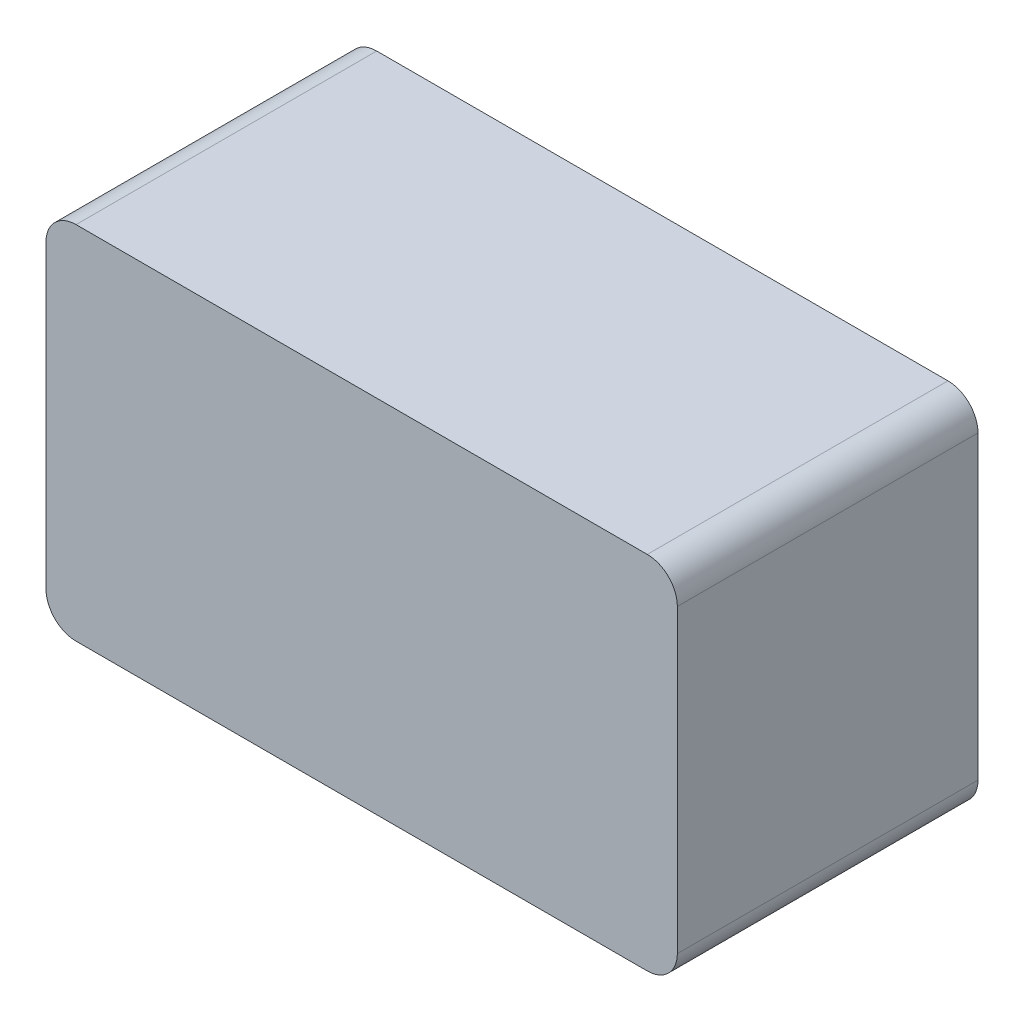
ISO-10303-21;
HEADER;
FILE_DESCRIPTION(('STEP AP214'),'2;1');
FILE_NAME('part.step','',(''),(''),'','','');
FILE_SCHEMA(('AUTOMOTIVE_DESIGN { 1 0 10303 214 1 1 1 1 }'));
ENDSEC;
DATA;
#1=APPLICATION_CONTEXT('core data for automotive mechanical design processes');
#2=APPLICATION_PROTOCOL_DEFINITION('international standard','automotive_design',2000,#1);
#3=PRODUCT_CONTEXT('',#1,'mechanical');
#4=PRODUCT('Part','Part','',(#3));
#5=PRODUCT_RELATED_PRODUCT_CATEGORY('part','',(#4));
#6=PRODUCT_DEFINITION_FORMATION('','',#4);
#7=PRODUCT_DEFINITION_CONTEXT('part definition',#1,'design');
#8=PRODUCT_DEFINITION('design','',#6,#7);
#9=PRODUCT_DEFINITION_SHAPE('','',#8);
#10=(LENGTH_UNIT() NAMED_UNIT(*) SI_UNIT(.MILLI.,.METRE.));
#11=(NAMED_UNIT(*) PLANE_ANGLE_UNIT() SI_UNIT($,.RADIAN.));
#12=(NAMED_UNIT(*) SI_UNIT($,.STERADIAN.) SOLID_ANGLE_UNIT());
#13=UNCERTAINTY_MEASURE_WITH_UNIT(LENGTH_MEASURE(1.E-05),#10,'distance_accuracy_value','');
#14=(GEOMETRIC_REPRESENTATION_CONTEXT(3) GLOBAL_UNCERTAINTY_ASSIGNED_CONTEXT((#13)) GLOBAL_UNIT_ASSIGNED_CONTEXT((#10,
#11,#12)) REPRESENTATION_CONTEXT('',''));
#15=CARTESIAN_POINT('',(0.,0.,0.));
#16=DIRECTION('',(0.,0.,1.));
#17=DIRECTION('',(1.,0.,0.));
#18=AXIS2_PLACEMENT_3D('',#15,#16,#17);
#19=CARTESIAN_POINT('',(9.8,4.88601489466054,9.79972765590264));
#20=DIRECTION('',(0.,0.,1.));
#21=DIRECTION('',(1.,0.,0.));
#22=AXIS2_PLACEMENT_3D('',#19,#20,#21);
#23=PLANE('',#22);
#24=DIRECTION('',(0.,1.,0.));
#25=VECTOR('',#24,1.);
#26=CARTESIAN_POINT('',(-9.8,4.88601489466054,9.79972765590264));
#27=LINE('',#26,#25);
#28=CARTESIAN_POINT('',(-9.8,-4.87522898981568,9.79972765590264));
#29=VERTEX_POINT('',#28);
#30=CARTESIAN_POINT('',(-9.8,4.88601489466054,9.79972765590264));
#31=VERTEX_POINT('',#30);
#32=EDGE_CURVE('E344',#29,#31,#27,.T.);
#33=ORIENTED_EDGE('',*,*,#32,.T.);
#34=DIRECTION('',(-1.,0.,0.));
#35=VECTOR('',#34,1.);
#36=CARTESIAN_POINT('',(9.8,4.88601489466054,9.79972765590264));
#37=LINE('',#36,#35);
#38=CARTESIAN_POINT('',(9.8,4.88601489466054,9.79972765590264));
#39=VERTEX_POINT('',#38);
#40=EDGE_CURVE('E315',#39,#31,#37,.T.);
#41=ORIENTED_EDGE('',*,*,#40,.F.);
#42=DIRECTION('',(0.,1.,0.));
#43=VECTOR('',#42,1.);
#44=CARTESIAN_POINT('',(9.8,4.88601489466054,9.79972765590264));
#45=LINE('',#44,#43);
#46=CARTESIAN_POINT('',(9.8,-4.87522898981567,9.79972765590264));
#47=VERTEX_POINT('',#46);
#48=EDGE_CURVE('E335',#47,#39,#45,.T.);
#49=ORIENTED_EDGE('',*,*,#48,.F.);
#50=DIRECTION('',(-1.,0.,0.));
#51=VECTOR('',#50,1.);
#52=CARTESIAN_POINT('',(9.8,-4.87522898981567,9.79972765590264));
#53=LINE('',#52,#51);
#54=EDGE_CURVE('E284',#47,#29,#53,.T.);
#55=ORIENTED_EDGE('',*,*,#54,.T.);
#56=EDGE_LOOP('',(#33,#41,#49,#55));
#57=FACE_BOUND('',#56,.T.);
#58=ADVANCED_FACE('F39',(#57),#23,.F.);
#59=CARTESIAN_POINT('',(9.8,-4.87522898981567,9.79972765590264));
#60=DIRECTION('',(0.,-1.,0.));
#61=DIRECTION('',(1.,0.,0.));
#62=AXIS2_PLACEMENT_3D('',#59,#60,#61);
#63=PLANE('',#62);
#64=CARTESIAN_POINT('',(0.,-4.87522898981567,5.));
#65=DIRECTION('',(0.,-1.,0.));
#66=DIRECTION('',(1.,0.,0.));
#67=AXIS2_PLACEMENT_3D('',#64,#65,#66);
#68=CIRCLE('',#67,1.);
#69=CARTESIAN_POINT('',(1.,-4.87522898981567,5.));
#70=VERTEX_POINT('',#69);
#71=EDGE_CURVE('E43',#70,#70,#68,.T.);
#72=ORIENTED_EDGE('',*,*,#71,.T.);
#73=EDGE_LOOP('',(#72));
#74=FACE_BOUND('',#73,.T.);
#75=DIRECTION('',(0.,0.,1.));
#76=VECTOR('',#75,1.);
#77=CARTESIAN_POINT('',(-9.8,-4.87522898981568,9.79972765590264));
#78=LINE('',#77,#76);
#79=CARTESIAN_POINT('',(-9.8,-4.87522898981568,1.63479768844573));
#80=VERTEX_POINT('',#79);
#81=EDGE_CURVE('E331',#80,#29,#78,.T.);
#82=ORIENTED_EDGE('',*,*,#81,.T.);
#83=ORIENTED_EDGE('',*,*,#54,.F.);
#84=DIRECTION('',(0.,0.,1.));
#85=VECTOR('',#84,1.);
#86=CARTESIAN_POINT('',(9.8,-4.87522898981567,9.79972765590264));
#87=LINE('',#86,#85);
#88=CARTESIAN_POINT('',(9.8,-4.87522898981567,1.63479768844573));
#89=VERTEX_POINT('',#88);
#90=EDGE_CURVE('E320',#89,#47,#87,.T.);
#91=ORIENTED_EDGE('',*,*,#90,.F.);
#92=DIRECTION('',(-1.,0.,0.));
#93=VECTOR('',#92,1.);
#94=CARTESIAN_POINT('',(9.8,-4.87522898981567,1.63479768844573));
#95=LINE('',#94,#93);
#96=EDGE_CURVE('E324',#89,#80,#95,.T.);
#97=ORIENTED_EDGE('',*,*,#96,.T.);
#98=EDGE_LOOP('',(#82,#83,#91,#97));
#99=FACE_BOUND('',#98,.T.);
#100=ADVANCED_FACE('F371',(#74,#99),#63,.F.);
#101=CARTESIAN_POINT('',(9.8,4.88601489466054,1.63479768844573));
#102=DIRECTION('',(0.,0.,-1.));
#103=DIRECTION('',(-1.,0.,0.));
#104=AXIS2_PLACEMENT_3D('',#101,#102,#103);
#105=PLANE('',#104);
#106=DIRECTION('',(0.,-1.,0.));
#107=VECTOR('',#106,1.);
#108=CARTESIAN_POINT('',(-9.8,4.88601489466054,1.63479768844573));
#109=LINE('',#108,#107);
#110=CARTESIAN_POINT('',(-9.8,4.88601489466054,1.63479768844573));
#111=VERTEX_POINT('',#110);
#112=EDGE_CURVE('E336',#111,#80,#109,.T.);
#113=ORIENTED_EDGE('',*,*,#112,.T.);
#114=ORIENTED_EDGE('',*,*,#96,.F.);
#115=DIRECTION('',(0.,-1.,0.));
#116=VECTOR('',#115,1.);
#117=CARTESIAN_POINT('',(9.8,4.88601489466054,1.63479768844573));
#118=LINE('',#117,#116);
#119=CARTESIAN_POINT('',(9.8,4.88601489466054,1.63479768844573));
#120=VERTEX_POINT('',#119);
#121=EDGE_CURVE('E351',#120,#89,#118,.T.);
#122=ORIENTED_EDGE('',*,*,#121,.F.);
#123=DIRECTION('',(-1.,0.,0.));
#124=VECTOR('',#123,1.);
#125=CARTESIAN_POINT('',(9.8,4.88601489466054,1.63479768844573));
#126=LINE('',#125,#124);
#127=EDGE_CURVE('E319',#120,#111,#126,.T.);
#128=ORIENTED_EDGE('',*,*,#127,.T.);
#129=EDGE_LOOP('',(#113,#114,#122,#128));
#130=FACE_BOUND('',#129,.T.);
#131=ADVANCED_FACE('F394',(#130),#105,.F.);
#132=CARTESIAN_POINT('',(9.8,4.88601489466054,9.79972765590264));
#133=DIRECTION('',(0.,1.,0.));
#134=DIRECTION('',(-1.,0.,0.));
#135=AXIS2_PLACEMENT_3D('',#132,#133,#134);
#136=PLANE('',#135);
#137=DIRECTION('',(0.,0.,-1.));
#138=VECTOR('',#137,1.);
#139=CARTESIAN_POINT('',(-9.8,4.88601489466054,9.79972765590264));
#140=LINE('',#139,#138);
#141=EDGE_CURVE('E340',#31,#111,#140,.T.);
#142=ORIENTED_EDGE('',*,*,#141,.T.);
#143=ORIENTED_EDGE('',*,*,#127,.F.);
#144=DIRECTION('',(0.,0.,-1.));
#145=VECTOR('',#144,1.);
#146=CARTESIAN_POINT('',(9.8,4.88601489466054,9.79972765590264));
#147=LINE('',#146,#145);
#148=EDGE_CURVE('E355',#39,#120,#147,.T.);
#149=ORIENTED_EDGE('',*,*,#148,.F.);
#150=ORIENTED_EDGE('',*,*,#40,.T.);
#151=EDGE_LOOP('',(#142,#143,#149,#150));
#152=FACE_BOUND('',#151,.T.);
#153=ADVANCED_FACE('F398',(#152),#136,.F.);
#154=CARTESIAN_POINT('',(9.8,0.,0.));
#155=DIRECTION('',(1.,0.,0.));
#156=DIRECTION('',(0.,0.,-1.));
#157=AXIS2_PLACEMENT_3D('',#154,#155,#156);
#158=PLANE('',#157);
#159=ORIENTED_EDGE('',*,*,#48,.T.);
#160=ORIENTED_EDGE('',*,*,#148,.T.);
#161=ORIENTED_EDGE('',*,*,#121,.T.);
#162=ORIENTED_EDGE('',*,*,#90,.T.);
#163=EDGE_LOOP('',(#159,#160,#161,#162));
#164=FACE_BOUND('',#163,.T.);
#165=ADVANCED_FACE('F384',(#164),#158,.F.);
#166=CARTESIAN_POINT('',(-9.8,0.,0.));
#167=DIRECTION('',(1.,0.,0.));
#168=DIRECTION('',(0.,0.,-1.));
#169=AXIS2_PLACEMENT_3D('',#166,#167,#168);
#170=PLANE('',#169);
#171=ORIENTED_EDGE('',*,*,#32,.F.);
#172=ORIENTED_EDGE('',*,*,#81,.F.);
#173=ORIENTED_EDGE('',*,*,#112,.F.);
#174=ORIENTED_EDGE('',*,*,#141,.F.);
#175=EDGE_LOOP('',(#171,#172,#173,#174));
#176=FACE_BOUND('',#175,.T.);
#177=ADVANCED_FACE('F376',(#176),#170,.T.);
#178=CARTESIAN_POINT('',(0.,-0.999999999999999,5.));
#179=DIRECTION('',(0.,-1.,0.));
#180=DIRECTION('',(0.,0.,-1.));
#181=AXIS2_PLACEMENT_3D('',#178,#179,#180);
#182=CYLINDRICAL_SURFACE('',#181,1.);
#183=CARTESIAN_POINT('',(0.,-6.,5.));
#184=DIRECTION('',(0.,-1.,0.));
#185=DIRECTION('',(0.,0.,-1.));
#186=AXIS2_PLACEMENT_3D('',#183,#184,#185);
#187=CIRCLE('',#186,1.);
#188=CARTESIAN_POINT('',(0.,-6.,4.));
#189=VERTEX_POINT('',#188);
#190=EDGE_CURVE('E362',#189,#189,#187,.T.);
#191=ORIENTED_EDGE('',*,*,#190,.T.);
#192=EDGE_LOOP('',(#191));
#193=FACE_BOUND('',#192,.T.);
#194=ORIENTED_EDGE('',*,*,#71,.F.);
#195=EDGE_LOOP('',(#194));
#196=FACE_BOUND('',#195,.T.);
#197=ADVANCED_FACE('F374',(#193,#196),#182,.F.);
#198=CARTESIAN_POINT('',(-9.5,-5.,10.));
#199=DIRECTION('',(0.,0.,-1.));
#200=DIRECTION('',(-1.,0.,0.));
#201=AXIS2_PLACEMENT_3D('',#198,#199,#200);
#202=CYLINDRICAL_SURFACE('',#201,1.);
#203=CARTESIAN_POINT('',(-9.5,-5.,0.));
#204=DIRECTION('',(0.,0.,1.));
#205=DIRECTION('',(1.,0.,0.));
#206=AXIS2_PLACEMENT_3D('',#203,#204,#205);
#207=CIRCLE('',#206,1.);
#208=CARTESIAN_POINT('',(-10.5,-4.99999999999999,0.));
#209=VERTEX_POINT('',#208);
#210=CARTESIAN_POINT('',(-9.49999999999999,-6.,0.));
#211=VERTEX_POINT('',#210);
#212=EDGE_CURVE('E154',#209,#211,#207,.T.);
#213=ORIENTED_EDGE('',*,*,#212,.T.);
#214=DIRECTION('',(0.,0.,-1.));
#215=VECTOR('',#214,1.);
#216=CARTESIAN_POINT('',(-9.49999999999999,-6.,10.));
#217=LINE('',#216,#215);
#218=CARTESIAN_POINT('',(-9.49999999999999,-6.,10.));
#219=VERTEX_POINT('',#218);
#220=EDGE_CURVE('E11',#219,#211,#217,.T.);
#221=ORIENTED_EDGE('',*,*,#220,.F.);
#222=CARTESIAN_POINT('',(-9.5,-5.,10.));
#223=DIRECTION('',(0.,0.,1.));
#224=DIRECTION('',(1.,0.,0.));
#225=AXIS2_PLACEMENT_3D('',#222,#223,#224);
#226=CIRCLE('',#225,1.);
#227=CARTESIAN_POINT('',(-10.5,-4.99999999999999,10.));
#228=VERTEX_POINT('',#227);
#229=EDGE_CURVE('E178',#228,#219,#226,.T.);
#230=ORIENTED_EDGE('',*,*,#229,.F.);
#231=DIRECTION('',(0.,0.,-1.));
#232=VECTOR('',#231,1.);
#233=CARTESIAN_POINT('',(-10.5,-4.99999999999999,10.));
#234=LINE('',#233,#232);
#235=EDGE_CURVE('E150',#228,#209,#234,.T.);
#236=ORIENTED_EDGE('',*,*,#235,.T.);
#237=EDGE_LOOP('',(#213,#221,#230,#236));
#238=FACE_BOUND('',#237,.T.);
#239=ADVANCED_FACE('F41',(#238),#202,.T.);
#240=CARTESIAN_POINT('',(-9.49999999999999,-6.,10.));
#241=DIRECTION('',(0.,1.,0.));
#242=DIRECTION('',(0.,0.,1.));
#243=AXIS2_PLACEMENT_3D('',#240,#241,#242);
#244=PLANE('',#243);
#245=ORIENTED_EDGE('',*,*,#190,.F.);
#246=EDGE_LOOP('',(#245));
#247=FACE_BOUND('',#246,.T.);
#248=DIRECTION('',(1.,0.,0.));
#249=VECTOR('',#248,1.);
#250=CARTESIAN_POINT('',(-9.49999999999999,-6.,0.));
#251=LINE('',#250,#249);
#252=CARTESIAN_POINT('',(9.49999999999999,-6.,0.));
#253=VERTEX_POINT('',#252);
#254=EDGE_CURVE('E158',#211,#253,#251,.T.);
#255=ORIENTED_EDGE('',*,*,#254,.T.);
#256=DIRECTION('',(0.,0.,-1.));
#257=VECTOR('',#256,1.);
#258=CARTESIAN_POINT('',(9.49999999999999,-6.,10.));
#259=LINE('',#258,#257);
#260=CARTESIAN_POINT('',(9.49999999999999,-6.,10.));
#261=VERTEX_POINT('',#260);
#262=EDGE_CURVE('E49',#261,#253,#259,.T.);
#263=ORIENTED_EDGE('',*,*,#262,.F.);
#264=DIRECTION('',(1.,0.,0.));
#265=VECTOR('',#264,1.);
#266=CARTESIAN_POINT('',(-9.49999999999999,-6.,10.));
#267=LINE('',#266,#265);
#268=EDGE_CURVE('E106',#219,#261,#267,.T.);
#269=ORIENTED_EDGE('',*,*,#268,.F.);
#270=ORIENTED_EDGE('',*,*,#220,.T.);
#271=EDGE_LOOP('',(#255,#263,#269,#270));
#272=FACE_BOUND('',#271,.T.);
#273=ADVANCED_FACE('F382',(#247,#272),#244,.F.);
#274=CARTESIAN_POINT('',(9.5,-5.,10.));
#275=DIRECTION('',(0.,0.,-1.));
#276=DIRECTION('',(-1.,0.,0.));
#277=AXIS2_PLACEMENT_3D('',#274,#275,#276);
#278=CYLINDRICAL_SURFACE('',#277,1.);
#279=CARTESIAN_POINT('',(9.5,-5.,0.));
#280=DIRECTION('',(0.,0.,1.));
#281=DIRECTION('',(1.,0.,0.));
#282=AXIS2_PLACEMENT_3D('',#279,#280,#281);
#283=CIRCLE('',#282,1.);
#284=CARTESIAN_POINT('',(10.5,-4.99999999999999,0.));
#285=VERTEX_POINT('',#284);
#286=EDGE_CURVE('E162',#253,#285,#283,.T.);
#287=ORIENTED_EDGE('',*,*,#286,.T.);
#288=DIRECTION('',(0.,0.,-1.));
#289=VECTOR('',#288,1.);
#290=CARTESIAN_POINT('',(10.5,-4.99999999999999,10.));
#291=LINE('',#290,#289);
#292=CARTESIAN_POINT('',(10.5,-4.99999999999999,10.));
#293=VERTEX_POINT('',#292);
#294=EDGE_CURVE('E189',#293,#285,#291,.T.);
#295=ORIENTED_EDGE('',*,*,#294,.F.);
#296=CARTESIAN_POINT('',(9.5,-5.,10.));
#297=DIRECTION('',(0.,0.,1.));
#298=DIRECTION('',(1.,0.,0.));
#299=AXIS2_PLACEMENT_3D('',#296,#297,#298);
#300=CIRCLE('',#299,1.);
#301=EDGE_CURVE('E200',#261,#293,#300,.T.);
#302=ORIENTED_EDGE('',*,*,#301,.F.);
#303=ORIENTED_EDGE('',*,*,#262,.T.);
#304=EDGE_LOOP('',(#287,#295,#302,#303));
#305=FACE_BOUND('',#304,.T.);
#306=ADVANCED_FACE('F198',(#305),#278,.T.);
#307=CARTESIAN_POINT('',(10.5,4.99999999999999,10.));
#308=DIRECTION('',(-1.,0.,0.));
#309=DIRECTION('',(0.,0.,1.));
#310=AXIS2_PLACEMENT_3D('',#307,#308,#309);
#311=PLANE('',#310);
#312=DIRECTION('',(0.,1.,0.));
#313=VECTOR('',#312,1.);
#314=CARTESIAN_POINT('',(10.5,4.99999999999999,0.));
#315=LINE('',#314,#313);
#316=CARTESIAN_POINT('',(10.5,4.99999999999999,0.));
#317=VERTEX_POINT('',#316);
#318=EDGE_CURVE('E165',#285,#317,#315,.T.);
#319=ORIENTED_EDGE('',*,*,#318,.T.);
#320=DIRECTION('',(0.,0.,-1.));
#321=VECTOR('',#320,1.);
#322=CARTESIAN_POINT('',(10.5,4.99999999999999,10.));
#323=LINE('',#322,#321);
#324=CARTESIAN_POINT('',(10.5,4.99999999999999,10.));
#325=VERTEX_POINT('',#324);
#326=EDGE_CURVE('E185',#325,#317,#323,.T.);
#327=ORIENTED_EDGE('',*,*,#326,.F.);
#328=DIRECTION('',(0.,1.,0.));
#329=VECTOR('',#328,1.);
#330=CARTESIAN_POINT('',(10.5,4.99999999999999,10.));
#331=LINE('',#330,#329);
#332=EDGE_CURVE('E213',#293,#325,#331,.T.);
#333=ORIENTED_EDGE('',*,*,#332,.F.);
#334=ORIENTED_EDGE('',*,*,#294,.T.);
#335=EDGE_LOOP('',(#319,#327,#333,#334));
#336=FACE_BOUND('',#335,.T.);
#337=ADVANCED_FACE('F208',(#336),#311,.F.);
#338=CARTESIAN_POINT('',(9.5,5.,10.));
#339=DIRECTION('',(0.,0.,-1.));
#340=DIRECTION('',(-1.,0.,0.));
#341=AXIS2_PLACEMENT_3D('',#338,#339,#340);
#342=CYLINDRICAL_SURFACE('',#341,1.);
#343=CARTESIAN_POINT('',(9.5,5.,0.));
#344=DIRECTION('',(0.,0.,1.));
#345=DIRECTION('',(1.,0.,0.));
#346=AXIS2_PLACEMENT_3D('',#343,#344,#345);
#347=CIRCLE('',#346,1.);
#348=CARTESIAN_POINT('',(9.49999999999999,6.,0.));
#349=VERTEX_POINT('',#348);
#350=EDGE_CURVE('E168',#317,#349,#347,.T.);
#351=ORIENTED_EDGE('',*,*,#350,.T.);
#352=DIRECTION('',(0.,0.,-1.));
#353=VECTOR('',#352,1.);
#354=CARTESIAN_POINT('',(9.49999999999999,6.,10.));
#355=LINE('',#354,#353);
#356=CARTESIAN_POINT('',(9.49999999999999,6.,10.));
#357=VERTEX_POINT('',#356);
#358=EDGE_CURVE('E143',#357,#349,#355,.T.);
#359=ORIENTED_EDGE('',*,*,#358,.F.);
#360=CARTESIAN_POINT('',(9.5,5.,10.));
#361=DIRECTION('',(0.,0.,1.));
#362=DIRECTION('',(1.,0.,0.));
#363=AXIS2_PLACEMENT_3D('',#360,#361,#362);
#364=CIRCLE('',#363,1.);
#365=EDGE_CURVE('E129',#325,#357,#364,.T.);
#366=ORIENTED_EDGE('',*,*,#365,.F.);
#367=ORIENTED_EDGE('',*,*,#326,.T.);
#368=EDGE_LOOP('',(#351,#359,#366,#367));
#369=FACE_BOUND('',#368,.T.);
#370=ADVANCED_FACE('F211',(#369),#342,.T.);
#371=CARTESIAN_POINT('',(-9.49999999999999,6.,10.));
#372=DIRECTION('',(0.,-1.,0.));
#373=DIRECTION('',(0.,0.,-1.));
#374=AXIS2_PLACEMENT_3D('',#371,#372,#373);
#375=PLANE('',#374);
#376=DIRECTION('',(-1.,0.,0.));
#377=VECTOR('',#376,1.);
#378=CARTESIAN_POINT('',(-9.49999999999999,6.,0.));
#379=LINE('',#378,#377);
#380=CARTESIAN_POINT('',(-9.49999999999999,6.,0.));
#381=VERTEX_POINT('',#380);
#382=EDGE_CURVE('E139',#349,#381,#379,.T.);
#383=ORIENTED_EDGE('',*,*,#382,.T.);
#384=DIRECTION('',(0.,0.,-1.));
#385=VECTOR('',#384,1.);
#386=CARTESIAN_POINT('',(-9.49999999999999,6.,10.));
#387=LINE('',#386,#385);
#388=CARTESIAN_POINT('',(-9.49999999999999,6.,10.));
#389=VERTEX_POINT('',#388);
#390=EDGE_CURVE('E136',#389,#381,#387,.T.);
#391=ORIENTED_EDGE('',*,*,#390,.F.);
#392=DIRECTION('',(-1.,0.,0.));
#393=VECTOR('',#392,1.);
#394=CARTESIAN_POINT('',(-9.49999999999999,6.,10.));
#395=LINE('',#394,#393);
#396=EDGE_CURVE('E122',#357,#389,#395,.T.);
#397=ORIENTED_EDGE('',*,*,#396,.F.);
#398=ORIENTED_EDGE('',*,*,#358,.T.);
#399=EDGE_LOOP('',(#383,#391,#397,#398));
#400=FACE_BOUND('',#399,.T.);
#401=ADVANCED_FACE('F137',(#400),#375,.F.);
#402=CARTESIAN_POINT('',(-9.5,5.,10.));
#403=DIRECTION('',(0.,0.,-1.));
#404=DIRECTION('',(-1.,0.,0.));
#405=AXIS2_PLACEMENT_3D('',#402,#403,#404);
#406=CYLINDRICAL_SURFACE('',#405,1.);
#407=CARTESIAN_POINT('',(-9.5,5.,0.));
#408=DIRECTION('',(0.,0.,1.));
#409=DIRECTION('',(1.,0.,0.));
#410=AXIS2_PLACEMENT_3D('',#407,#408,#409);
#411=CIRCLE('',#410,1.);
#412=CARTESIAN_POINT('',(-10.5,4.99999999999999,0.));
#413=VERTEX_POINT('',#412);
#414=EDGE_CURVE('E173',#381,#413,#411,.T.);
#415=ORIENTED_EDGE('',*,*,#414,.T.);
#416=DIRECTION('',(0.,0.,-1.));
#417=VECTOR('',#416,1.);
#418=CARTESIAN_POINT('',(-10.5,4.99999999999999,10.));
#419=LINE('',#418,#417);
#420=CARTESIAN_POINT('',(-10.5,4.99999999999999,10.));
#421=VERTEX_POINT('',#420);
#422=EDGE_CURVE('E144',#421,#413,#419,.T.);
#423=ORIENTED_EDGE('',*,*,#422,.F.);
#424=CARTESIAN_POINT('',(-9.5,5.,10.));
#425=DIRECTION('',(0.,0.,1.));
#426=DIRECTION('',(1.,0.,0.));
#427=AXIS2_PLACEMENT_3D('',#424,#425,#426);
#428=CIRCLE('',#427,1.);
#429=EDGE_CURVE('E126',#389,#421,#428,.T.);
#430=ORIENTED_EDGE('',*,*,#429,.F.);
#431=ORIENTED_EDGE('',*,*,#390,.T.);
#432=EDGE_LOOP('',(#415,#423,#430,#431));
#433=FACE_BOUND('',#432,.T.);
#434=ADVANCED_FACE('F146',(#433),#406,.T.);
#435=CARTESIAN_POINT('',(-10.5,4.99999999999999,10.));
#436=DIRECTION('',(1.,0.,0.));
#437=DIRECTION('',(0.,1.,0.));
#438=AXIS2_PLACEMENT_3D('',#435,#436,#437);
#439=PLANE('',#438);
#440=DIRECTION('',(0.,-1.,0.));
#441=VECTOR('',#440,1.);
#442=CARTESIAN_POINT('',(-10.5,4.99999999999999,0.));
#443=LINE('',#442,#441);
#444=EDGE_CURVE('E98',#413,#209,#443,.T.);
#445=ORIENTED_EDGE('',*,*,#444,.T.);
#446=ORIENTED_EDGE('',*,*,#235,.F.);
#447=DIRECTION('',(0.,-1.,0.));
#448=VECTOR('',#447,1.);
#449=CARTESIAN_POINT('',(-10.5,4.99999999999999,10.));
#450=LINE('',#449,#448);
#451=EDGE_CURVE('E65',#421,#228,#450,.T.);
#452=ORIENTED_EDGE('',*,*,#451,.F.);
#453=ORIENTED_EDGE('',*,*,#422,.T.);
#454=EDGE_LOOP('',(#445,#446,#452,#453));
#455=FACE_BOUND('',#454,.T.);
#456=ADVANCED_FACE('F437',(#455),#439,.F.);
#457=CARTESIAN_POINT('',(-9.5,-5.,10.));
#458=DIRECTION('',(0.,0.,1.));
#459=DIRECTION('',(1.,0.,0.));
#460=AXIS2_PLACEMENT_3D('',#457,#458,#459);
#461=PLANE('',#460);
#462=ORIENTED_EDGE('',*,*,#229,.T.);
#463=ORIENTED_EDGE('',*,*,#268,.T.);
#464=ORIENTED_EDGE('',*,*,#301,.T.);
#465=ORIENTED_EDGE('',*,*,#332,.T.);
#466=ORIENTED_EDGE('',*,*,#365,.T.);
#467=ORIENTED_EDGE('',*,*,#396,.T.);
#468=ORIENTED_EDGE('',*,*,#429,.T.);
#469=ORIENTED_EDGE('',*,*,#451,.T.);
#470=EDGE_LOOP('',(#462,#463,#464,#465,#466,#467,#468,#469));
#471=FACE_BOUND('',#470,.T.);
#472=ADVANCED_FACE('F124',(#471),#461,.T.);
#473=CARTESIAN_POINT('',(-9.5,-5.,0.));
#474=DIRECTION('',(0.,0.,1.));
#475=DIRECTION('',(1.,0.,0.));
#476=AXIS2_PLACEMENT_3D('',#473,#474,#475);
#477=PLANE('',#476);
#478=DIRECTION('',(0.,1.,0.));
#479=VECTOR('',#478,1.);
#480=CARTESIAN_POINT('',(-9.84021216671516,5.25287298049639,0.));
#481=LINE('',#480,#479);
#482=CARTESIAN_POINT('',(-9.84021216671516,-5.29662943537776,0.));
#483=VERTEX_POINT('',#482);
#484=CARTESIAN_POINT('',(-9.84021216671516,5.25287298049639,0.));
#485=VERTEX_POINT('',#484);
#486=EDGE_CURVE('E278',#483,#485,#481,.T.);
#487=ORIENTED_EDGE('',*,*,#486,.F.);
#488=CARTESIAN_POINT('',(-9.74021216671516,-5.29662943537776,0.));
#489=DIRECTION('',(0.,0.,-1.));
#490=DIRECTION('',(1.,0.,0.));
#491=AXIS2_PLACEMENT_3D('',#488,#489,#490);
#492=CIRCLE('',#491,0.0999999999999998);
#493=CARTESIAN_POINT('',(-9.74021216671516,-5.39662943537776,0.));
#494=VERTEX_POINT('',#493);
#495=EDGE_CURVE('E56',#494,#483,#492,.T.);
#496=ORIENTED_EDGE('',*,*,#495,.F.);
#497=DIRECTION('',(-1.,0.,0.));
#498=VECTOR('',#497,1.);
#499=CARTESIAN_POINT('',(9.75978783328484,-5.39662943537776,0.));
#500=LINE('',#499,#498);
#501=CARTESIAN_POINT('',(9.75978783328484,-5.39662943537776,0.));
#502=VERTEX_POINT('',#501);
#503=EDGE_CURVE('E253',#502,#494,#500,.T.);
#504=ORIENTED_EDGE('',*,*,#503,.F.);
#505=CARTESIAN_POINT('',(9.75978783328484,-5.29662943537776,0.));
#506=DIRECTION('',(0.,0.,-1.));
#507=DIRECTION('',(1.,0.,0.));
#508=AXIS2_PLACEMENT_3D('',#505,#506,#507);
#509=CIRCLE('',#508,0.0999999999999998);
#510=CARTESIAN_POINT('',(9.85978783328484,-5.29662943537776,0.));
#511=VERTEX_POINT('',#510);
#512=EDGE_CURVE('E258',#511,#502,#509,.T.);
#513=ORIENTED_EDGE('',*,*,#512,.F.);
#514=DIRECTION('',(0.,-1.,0.));
#515=VECTOR('',#514,1.);
#516=CARTESIAN_POINT('',(9.85978783328484,5.25287298049639,0.));
#517=LINE('',#516,#515);
#518=CARTESIAN_POINT('',(9.85978783328484,5.25287298049639,0.));
#519=VERTEX_POINT('',#518);
#520=EDGE_CURVE('E262',#519,#511,#517,.T.);
#521=ORIENTED_EDGE('',*,*,#520,.F.);
#522=CARTESIAN_POINT('',(9.75978783328484,5.25287298049639,0.));
#523=DIRECTION('',(0.,0.,-1.));
#524=DIRECTION('',(-1.,0.,0.));
#525=AXIS2_PLACEMENT_3D('',#522,#523,#524);
#526=CIRCLE('',#525,0.0999999999999998);
#527=CARTESIAN_POINT('',(9.75978783328484,5.35287298049639,0.));
#528=VERTEX_POINT('',#527);
#529=EDGE_CURVE('E266',#528,#519,#526,.T.);
#530=ORIENTED_EDGE('',*,*,#529,.F.);
#531=DIRECTION('',(1.,0.,0.));
#532=VECTOR('',#531,1.);
#533=CARTESIAN_POINT('',(9.75978783328484,5.35287298049639,0.));
#534=LINE('',#533,#532);
#535=CARTESIAN_POINT('',(-9.74021216671516,5.35287298049639,0.));
#536=VERTEX_POINT('',#535);
#537=EDGE_CURVE('E270',#536,#528,#534,.T.);
#538=ORIENTED_EDGE('',*,*,#537,.F.);
#539=CARTESIAN_POINT('',(-9.74021216671516,5.25287298049639,0.));
#540=DIRECTION('',(0.,0.,-1.));
#541=DIRECTION('',(-1.,0.,0.));
#542=AXIS2_PLACEMENT_3D('',#539,#540,#541);
#543=CIRCLE('',#542,0.0999999999999998);
#544=EDGE_CURVE('E274',#485,#536,#543,.T.);
#545=ORIENTED_EDGE('',*,*,#544,.F.);
#546=EDGE_LOOP('',(#487,#496,#504,#513,#521,#530,#538,#545));
#547=FACE_BOUND('',#546,.T.);
#548=ORIENTED_EDGE('',*,*,#212,.F.);
#549=ORIENTED_EDGE('',*,*,#444,.F.);
#550=ORIENTED_EDGE('',*,*,#414,.F.);
#551=ORIENTED_EDGE('',*,*,#382,.F.);
#552=ORIENTED_EDGE('',*,*,#350,.F.);
#553=ORIENTED_EDGE('',*,*,#318,.F.);
#554=ORIENTED_EDGE('',*,*,#286,.F.);
#555=ORIENTED_EDGE('',*,*,#254,.F.);
#556=EDGE_LOOP('',(#548,#549,#550,#551,#552,#553,#554,#555));
#557=FACE_BOUND('',#556,.T.);
#558=ADVANCED_FACE('F204',(#547,#557),#477,.F.);
#559=CARTESIAN_POINT('',(-9.74021216671516,-5.29662943537776,1.6));
#560=DIRECTION('',(0.,0.,-1.));
#561=DIRECTION('',(-1.,0.,0.));
#562=AXIS2_PLACEMENT_3D('',#559,#560,#561);
#563=CYLINDRICAL_SURFACE('',#562,0.0999999999999998);
#564=ORIENTED_EDGE('',*,*,#495,.T.);
#565=DIRECTION('',(0.,0.,-1.));
#566=VECTOR('',#565,1.);
#567=CARTESIAN_POINT('',(-9.84021216671516,-5.29662943537776,1.6));
#568=LINE('',#567,#566);
#569=CARTESIAN_POINT('',(-9.84021216671516,-5.29662943537776,1.6));
#570=VERTEX_POINT('',#569);
#571=EDGE_CURVE('E223',#570,#483,#568,.T.);
#572=ORIENTED_EDGE('',*,*,#571,.F.);
#573=CARTESIAN_POINT('',(-9.74021216671516,-5.29662943537776,1.6));
#574=DIRECTION('',(0.,0.,-1.));
#575=DIRECTION('',(1.,0.,0.));
#576=AXIS2_PLACEMENT_3D('',#573,#574,#575);
#577=CIRCLE('',#576,0.0999999999999998);
#578=CARTESIAN_POINT('',(-9.74021216671516,-5.39662943537776,1.6));
#579=VERTEX_POINT('',#578);
#580=EDGE_CURVE('E257',#579,#570,#577,.T.);
#581=ORIENTED_EDGE('',*,*,#580,.F.);
#582=DIRECTION('',(0.,0.,-1.));
#583=VECTOR('',#582,1.);
#584=CARTESIAN_POINT('',(-9.74021216671516,-5.39662943537776,1.6));
#585=LINE('',#584,#583);
#586=EDGE_CURVE('E159',#579,#494,#585,.T.);
#587=ORIENTED_EDGE('',*,*,#586,.T.);
#588=EDGE_LOOP('',(#564,#572,#581,#587));
#589=FACE_BOUND('',#588,.T.);
#590=ADVANCED_FACE('F409',(#589),#563,.F.);
#591=CARTESIAN_POINT('',(9.75978783328484,-5.39662943537776,1.6));
#592=DIRECTION('',(0.,-1.,0.));
#593=DIRECTION('',(0.,0.,-1.));
#594=AXIS2_PLACEMENT_3D('',#591,#592,#593);
#595=PLANE('',#594);
#596=ORIENTED_EDGE('',*,*,#503,.T.);
#597=ORIENTED_EDGE('',*,*,#586,.F.);
#598=DIRECTION('',(-1.,0.,0.));
#599=VECTOR('',#598,1.);
#600=CARTESIAN_POINT('',(9.75978783328484,-5.39662943537776,1.6));
#601=LINE('',#600,#599);
#602=CARTESIAN_POINT('',(9.75978783328484,-5.39662943537776,1.6));
#603=VERTEX_POINT('',#602);
#604=EDGE_CURVE('E227',#603,#579,#601,.T.);
#605=ORIENTED_EDGE('',*,*,#604,.F.);
#606=DIRECTION('',(0.,0.,-1.));
#607=VECTOR('',#606,1.);
#608=CARTESIAN_POINT('',(9.75978783328484,-5.39662943537776,1.6));
#609=LINE('',#608,#607);
#610=EDGE_CURVE('E247',#603,#502,#609,.T.);
#611=ORIENTED_EDGE('',*,*,#610,.T.);
#612=EDGE_LOOP('',(#596,#597,#605,#611));
#613=FACE_BOUND('',#612,.T.);
#614=ADVANCED_FACE('F405',(#613),#595,.F.);
#615=CARTESIAN_POINT('',(9.75978783328484,-5.29662943537776,1.6));
#616=DIRECTION('',(0.,0.,-1.));
#617=DIRECTION('',(-1.,0.,0.));
#618=AXIS2_PLACEMENT_3D('',#615,#616,#617);
#619=CYLINDRICAL_SURFACE('',#618,0.0999999999999998);
#620=ORIENTED_EDGE('',*,*,#512,.T.);
#621=ORIENTED_EDGE('',*,*,#610,.F.);
#622=CARTESIAN_POINT('',(9.75978783328484,-5.29662943537776,1.6));
#623=DIRECTION('',(0.,0.,-1.));
#624=DIRECTION('',(1.,0.,0.));
#625=AXIS2_PLACEMENT_3D('',#622,#623,#624);
#626=CIRCLE('',#625,0.0999999999999998);
#627=CARTESIAN_POINT('',(9.85978783328484,-5.29662943537776,1.6));
#628=VERTEX_POINT('',#627);
#629=EDGE_CURVE('E288',#628,#603,#626,.T.);
#630=ORIENTED_EDGE('',*,*,#629,.F.);
#631=DIRECTION('',(0.,0.,-1.));
#632=VECTOR('',#631,1.);
#633=CARTESIAN_POINT('',(9.85978783328484,-5.29662943537776,1.6));
#634=LINE('',#633,#632);
#635=EDGE_CURVE('E243',#628,#511,#634,.T.);
#636=ORIENTED_EDGE('',*,*,#635,.T.);
#637=EDGE_LOOP('',(#620,#621,#630,#636));
#638=FACE_BOUND('',#637,.T.);
#639=ADVANCED_FACE('F408',(#638),#619,.F.);
#640=CARTESIAN_POINT('',(9.85978783328484,5.25287298049639,1.6));
#641=DIRECTION('',(1.,0.,0.));
#642=DIRECTION('',(0.,0.,-1.));
#643=AXIS2_PLACEMENT_3D('',#640,#641,#642);
#644=PLANE('',#643);
#645=ORIENTED_EDGE('',*,*,#520,.T.);
#646=ORIENTED_EDGE('',*,*,#635,.F.);
#647=DIRECTION('',(0.,-1.,0.));
#648=VECTOR('',#647,1.);
#649=CARTESIAN_POINT('',(9.85978783328484,5.25287298049639,1.6));
#650=LINE('',#649,#648);
#651=CARTESIAN_POINT('',(9.85978783328484,5.25287298049639,1.6));
#652=VERTEX_POINT('',#651);
#653=EDGE_CURVE('E292',#652,#628,#650,.T.);
#654=ORIENTED_EDGE('',*,*,#653,.F.);
#655=DIRECTION('',(0.,0.,-1.));
#656=VECTOR('',#655,1.);
#657=CARTESIAN_POINT('',(9.85978783328484,5.25287298049639,1.6));
#658=LINE('',#657,#656);
#659=EDGE_CURVE('E239',#652,#519,#658,.T.);
#660=ORIENTED_EDGE('',*,*,#659,.T.);
#661=EDGE_LOOP('',(#645,#646,#654,#660));
#662=FACE_BOUND('',#661,.T.);
#663=ADVANCED_FACE('F413',(#662),#644,.F.);
#664=CARTESIAN_POINT('',(9.75978783328484,5.25287298049639,1.6));
#665=DIRECTION('',(0.,0.,-1.));
#666=DIRECTION('',(-1.,0.,0.));
#667=AXIS2_PLACEMENT_3D('',#664,#665,#666);
#668=CYLINDRICAL_SURFACE('',#667,0.0999999999999998);
#669=ORIENTED_EDGE('',*,*,#529,.T.);
#670=ORIENTED_EDGE('',*,*,#659,.F.);
#671=CARTESIAN_POINT('',(9.75978783328484,5.25287298049639,1.6));
#672=DIRECTION('',(0.,0.,-1.));
#673=DIRECTION('',(-1.,0.,0.));
#674=AXIS2_PLACEMENT_3D('',#671,#672,#673);
#675=CIRCLE('',#674,0.0999999999999998);
#676=CARTESIAN_POINT('',(9.75978783328484,5.35287298049639,1.6));
#677=VERTEX_POINT('',#676);
#678=EDGE_CURVE('E296',#677,#652,#675,.T.);
#679=ORIENTED_EDGE('',*,*,#678,.F.);
#680=DIRECTION('',(0.,0.,-1.));
#681=VECTOR('',#680,1.);
#682=CARTESIAN_POINT('',(9.75978783328484,5.35287298049639,1.6));
#683=LINE('',#682,#681);
#684=EDGE_CURVE('E235',#677,#528,#683,.T.);
#685=ORIENTED_EDGE('',*,*,#684,.T.);
#686=EDGE_LOOP('',(#669,#670,#679,#685));
#687=FACE_BOUND('',#686,.T.);
#688=ADVANCED_FACE('F417',(#687),#668,.F.);
#689=CARTESIAN_POINT('',(9.75978783328484,5.35287298049639,1.6));
#690=DIRECTION('',(0.,1.,0.));
#691=DIRECTION('',(0.,0.,1.));
#692=AXIS2_PLACEMENT_3D('',#689,#690,#691);
#693=PLANE('',#692);
#694=ORIENTED_EDGE('',*,*,#537,.T.);
#695=ORIENTED_EDGE('',*,*,#684,.F.);
#696=DIRECTION('',(1.,0.,0.));
#697=VECTOR('',#696,1.);
#698=CARTESIAN_POINT('',(9.75978783328484,5.35287298049639,1.6));
#699=LINE('',#698,#697);
#700=CARTESIAN_POINT('',(-9.74021216671516,5.35287298049639,1.6));
#701=VERTEX_POINT('',#700);
#702=EDGE_CURVE('E300',#701,#677,#699,.T.);
#703=ORIENTED_EDGE('',*,*,#702,.F.);
#704=DIRECTION('',(0.,0.,-1.));
#705=VECTOR('',#704,1.);
#706=CARTESIAN_POINT('',(-9.74021216671516,5.35287298049639,1.6));
#707=LINE('',#706,#705);
#708=EDGE_CURVE('E231',#701,#536,#707,.T.);
#709=ORIENTED_EDGE('',*,*,#708,.T.);
#710=EDGE_LOOP('',(#694,#695,#703,#709));
#711=FACE_BOUND('',#710,.T.);
#712=ADVANCED_FACE('F421',(#711),#693,.F.);
#713=CARTESIAN_POINT('',(-9.74021216671516,5.25287298049639,1.6));
#714=DIRECTION('',(0.,0.,-1.));
#715=DIRECTION('',(-1.,0.,0.));
#716=AXIS2_PLACEMENT_3D('',#713,#714,#715);
#717=CYLINDRICAL_SURFACE('',#716,0.0999999999999998);
#718=ORIENTED_EDGE('',*,*,#544,.T.);
#719=ORIENTED_EDGE('',*,*,#708,.F.);
#720=CARTESIAN_POINT('',(-9.74021216671516,5.25287298049639,1.6));
#721=DIRECTION('',(0.,0.,-1.));
#722=DIRECTION('',(-1.,0.,0.));
#723=AXIS2_PLACEMENT_3D('',#720,#721,#722);
#724=CIRCLE('',#723,0.0999999999999998);
#725=CARTESIAN_POINT('',(-9.84021216671516,5.25287298049639,1.6));
#726=VERTEX_POINT('',#725);
#727=EDGE_CURVE('E304',#726,#701,#724,.T.);
#728=ORIENTED_EDGE('',*,*,#727,.F.);
#729=DIRECTION('',(0.,0.,-1.));
#730=VECTOR('',#729,1.);
#731=CARTESIAN_POINT('',(-9.84021216671516,5.25287298049639,1.6));
#732=LINE('',#731,#730);
#733=EDGE_CURVE('E226',#726,#485,#732,.T.);
#734=ORIENTED_EDGE('',*,*,#733,.T.);
#735=EDGE_LOOP('',(#718,#719,#728,#734));
#736=FACE_BOUND('',#735,.T.);
#737=ADVANCED_FACE('F425',(#736),#717,.F.);
#738=CARTESIAN_POINT('',(-9.84021216671516,5.25287298049639,1.6));
#739=DIRECTION('',(-1.,0.,0.));
#740=DIRECTION('',(0.,0.,1.));
#741=AXIS2_PLACEMENT_3D('',#738,#739,#740);
#742=PLANE('',#741);
#743=ORIENTED_EDGE('',*,*,#486,.T.);
#744=ORIENTED_EDGE('',*,*,#733,.F.);
#745=DIRECTION('',(0.,1.,0.));
#746=VECTOR('',#745,1.);
#747=CARTESIAN_POINT('',(-9.84021216671516,5.25287298049639,1.6));
#748=LINE('',#747,#746);
#749=EDGE_CURVE('E308',#570,#726,#748,.T.);
#750=ORIENTED_EDGE('',*,*,#749,.F.);
#751=ORIENTED_EDGE('',*,*,#571,.T.);
#752=EDGE_LOOP('',(#743,#744,#750,#751));
#753=FACE_BOUND('',#752,.T.);
#754=ADVANCED_FACE('F403',(#753),#742,.F.);
#755=CARTESIAN_POINT('',(-9.74021216671516,-5.29662943537776,1.6));
#756=DIRECTION('',(0.,0.,1.));
#757=DIRECTION('',(1.,0.,0.));
#758=AXIS2_PLACEMENT_3D('',#755,#756,#757);
#759=PLANE('',#758);
#760=ORIENTED_EDGE('',*,*,#580,.T.);
#761=ORIENTED_EDGE('',*,*,#749,.T.);
#762=ORIENTED_EDGE('',*,*,#727,.T.);
#763=ORIENTED_EDGE('',*,*,#702,.T.);
#764=ORIENTED_EDGE('',*,*,#678,.T.);
#765=ORIENTED_EDGE('',*,*,#653,.T.);
#766=ORIENTED_EDGE('',*,*,#629,.T.);
#767=ORIENTED_EDGE('',*,*,#604,.T.);
#768=EDGE_LOOP('',(#760,#761,#762,#763,#764,#765,#766,#767));
#769=FACE_BOUND('',#768,.T.);
#770=ADVANCED_FACE('F400',(#769),#759,.F.);
#771=CLOSED_SHELL('',(#58,#100,#131,#153,#165,#177,#197,#239,#273,#306,#337,#370,#401,#434,#456,
#472,#558,#590,#614,#639,#663,#688,#712,#737,#754,#770));
#772=MANIFOLD_SOLID_BREP('B2',#771);
#773=ADVANCED_BREP_SHAPE_REPRESENTATION('',(#18,#772),#14);
#774=SHAPE_DEFINITION_REPRESENTATION(#9,#773);
ENDSEC;
END-ISO-10303-21;
